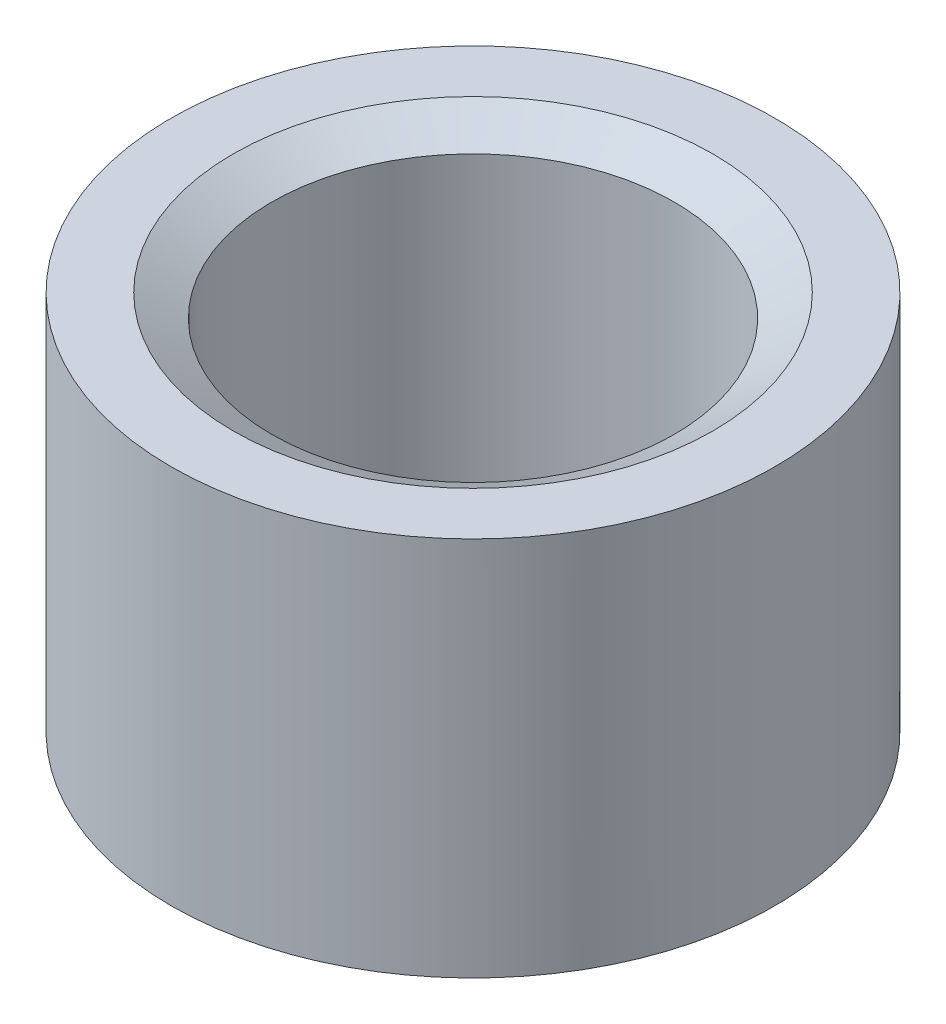
ISO-10303-21;
HEADER;
FILE_DESCRIPTION(('STEP AP214'),'2;1');
FILE_NAME('part.step','',(''),(''),'','','');
FILE_SCHEMA(('AUTOMOTIVE_DESIGN { 1 0 10303 214 1 1 1 1 }'));
ENDSEC;
DATA;
#1=APPLICATION_CONTEXT('core data for automotive mechanical design processes');
#2=APPLICATION_PROTOCOL_DEFINITION('international standard','automotive_design',2000,#1);
#3=PRODUCT_CONTEXT('',#1,'mechanical');
#4=PRODUCT('Part','Part','',(#3));
#5=PRODUCT_RELATED_PRODUCT_CATEGORY('part','',(#4));
#6=PRODUCT_DEFINITION_FORMATION('','',#4);
#7=PRODUCT_DEFINITION_CONTEXT('part definition',#1,'design');
#8=PRODUCT_DEFINITION('design','',#6,#7);
#9=PRODUCT_DEFINITION_SHAPE('','',#8);
#10=(LENGTH_UNIT() NAMED_UNIT(*) SI_UNIT(.MILLI.,.METRE.));
#11=(NAMED_UNIT(*) PLANE_ANGLE_UNIT() SI_UNIT($,.RADIAN.));
#12=(NAMED_UNIT(*) SI_UNIT($,.STERADIAN.) SOLID_ANGLE_UNIT());
#13=UNCERTAINTY_MEASURE_WITH_UNIT(LENGTH_MEASURE(1.E-05),#10,'distance_accuracy_value','');
#14=(GEOMETRIC_REPRESENTATION_CONTEXT(3) GLOBAL_UNCERTAINTY_ASSIGNED_CONTEXT((#13)) GLOBAL_UNIT_ASSIGNED_CONTEXT((#10,
#11,#12)) REPRESENTATION_CONTEXT('',''));
#15=CARTESIAN_POINT('',(0.,0.,0.));
#16=DIRECTION('',(0.,0.,1.));
#17=DIRECTION('',(1.,0.,0.));
#18=AXIS2_PLACEMENT_3D('',#15,#16,#17);
#19=CARTESIAN_POINT('',(0.,0.,0.));
#20=DIRECTION('',(0.,1.,0.));
#21=DIRECTION('',(0.,0.,1.));
#22=AXIS2_PLACEMENT_3D('',#19,#20,#21);
#23=CYLINDRICAL_SURFACE('',#22,2.38125);
#24=CARTESIAN_POINT('',(0.,-2.999023637951,0.));
#25=DIRECTION('',(0.,-1.,0.));
#26=DIRECTION('',(0.,0.,-1.));
#27=AXIS2_PLACEMENT_3D('',#24,#25,#26);
#28=CIRCLE('',#27,2.38125);
#29=CARTESIAN_POINT('',(0.,-2.999023637951,-2.38125));
#30=VERTEX_POINT('',#29);
#31=EDGE_CURVE('E39',#30,#30,#28,.F.);
#32=ORIENTED_EDGE('',*,*,#31,.T.);
#33=EDGE_LOOP('',(#32));
#34=FACE_BOUND('',#33,.T.);
#35=CARTESIAN_POINT('',(0.,0.,0.));
#36=DIRECTION('',(0.,1.,0.));
#37=DIRECTION('',(0.,0.,1.));
#38=AXIS2_PLACEMENT_3D('',#35,#36,#37);
#39=CIRCLE('',#38,2.38125);
#40=CARTESIAN_POINT('',(0.,0.,2.38125));
#41=VERTEX_POINT('',#40);
#42=EDGE_CURVE('E55',#41,#41,#39,.T.);
#43=ORIENTED_EDGE('',*,*,#42,.F.);
#44=EDGE_LOOP('',(#43));
#45=FACE_BOUND('',#44,.T.);
#46=ADVANCED_FACE('F32',(#34,#45),#23,.T.);
#47=CARTESIAN_POINT('',(2.38125,-3.175,0.));
#48=DIRECTION('',(0.,-1.,0.));
#49=DIRECTION('',(0.,0.,-1.));
#50=AXIS2_PLACEMENT_3D('',#47,#48,#49);
#51=PLANE('',#50);
#52=CARTESIAN_POINT('',(0.,-3.175,0.));
#53=DIRECTION('',(0.,-1.,0.));
#54=DIRECTION('',(0.,0.,-1.));
#55=AXIS2_PLACEMENT_3D('',#52,#53,#54);
#56=CIRCLE('',#55,2.07645);
#57=CARTESIAN_POINT('',(0.,-3.175,-2.07645));
#58=VERTEX_POINT('',#57);
#59=EDGE_CURVE('E10',#58,#58,#56,.T.);
#60=ORIENTED_EDGE('',*,*,#59,.T.);
#61=EDGE_LOOP('',(#60));
#62=FACE_BOUND('',#61,.T.);
#63=CARTESIAN_POINT('',(0.,-3.175,0.));
#64=DIRECTION('',(0.,1.,0.));
#65=DIRECTION('',(0.,0.,1.));
#66=AXIS2_PLACEMENT_3D('',#63,#64,#65);
#67=CIRCLE('',#66,1.5875);
#68=CARTESIAN_POINT('',(0.,-3.175,1.5875));
#69=VERTEX_POINT('',#68);
#70=EDGE_CURVE('E52',#69,#69,#67,.T.);
#71=ORIENTED_EDGE('',*,*,#70,.T.);
#72=EDGE_LOOP('',(#71));
#73=FACE_BOUND('',#72,.T.);
#74=ADVANCED_FACE('F62',(#62,#73),#51,.T.);
#75=CARTESIAN_POINT('',(0.,0.,0.));
#76=DIRECTION('',(0.,1.,0.));
#77=DIRECTION('',(0.,0.,1.));
#78=AXIS2_PLACEMENT_3D('',#75,#76,#77);
#79=CYLINDRICAL_SURFACE('',#78,1.5875);
#80=CARTESIAN_POINT('',(0.,-0.175976362048998,0.));
#81=DIRECTION('',(0.,1.,0.));
#82=DIRECTION('',(0.,0.,1.));
#83=AXIS2_PLACEMENT_3D('',#80,#81,#82);
#84=CIRCLE('',#83,1.5875);
#85=CARTESIAN_POINT('',(0.,-0.175976362048998,1.5875));
#86=VERTEX_POINT('',#85);
#87=EDGE_CURVE('E47',#86,#86,#84,.T.);
#88=ORIENTED_EDGE('',*,*,#87,.T.);
#89=EDGE_LOOP('',(#88));
#90=FACE_BOUND('',#89,.T.);
#91=ORIENTED_EDGE('',*,*,#70,.F.);
#92=EDGE_LOOP('',(#91));
#93=FACE_BOUND('',#92,.T.);
#94=ADVANCED_FACE('F67',(#90,#93),#79,.F.);
#95=CARTESIAN_POINT('',(2.38125,0.,0.));
#96=DIRECTION('',(0.,1.,0.));
#97=DIRECTION('',(0.,0.,1.));
#98=AXIS2_PLACEMENT_3D('',#95,#96,#97);
#99=PLANE('',#98);
#100=CARTESIAN_POINT('',(0.,0.,0.));
#101=DIRECTION('',(0.,1.,0.));
#102=DIRECTION('',(0.,0.,1.));
#103=AXIS2_PLACEMENT_3D('',#100,#101,#102);
#104=CIRCLE('',#103,1.8923);
#105=CARTESIAN_POINT('',(0.,0.,1.8923));
#106=VERTEX_POINT('',#105);
#107=EDGE_CURVE('E43',#106,#106,#104,.F.);
#108=ORIENTED_EDGE('',*,*,#107,.T.);
#109=EDGE_LOOP('',(#108));
#110=FACE_BOUND('',#109,.T.);
#111=ORIENTED_EDGE('',*,*,#42,.T.);
#112=EDGE_LOOP('',(#111));
#113=FACE_BOUND('',#112,.T.);
#114=ADVANCED_FACE('F59',(#110,#113),#99,.T.);
#115=CARTESIAN_POINT('',(0.,-0.175976362048998,0.));
#116=DIRECTION('',(0.,1.,0.));
#117=DIRECTION('',(0.,0.,1.));
#118=AXIS2_PLACEMENT_3D('',#115,#116,#117);
#119=CONICAL_SURFACE('',#118,1.5875,1.0471975511966);
#120=CARTESIAN_POINT('',(0.,0.,1.8923));
#121=CARTESIAN_POINT('',(0.,-0.001833087104677,1.889125));
#122=CARTESIAN_POINT('',(0.,-0.00366617420935408,1.88595));
#123=CARTESIAN_POINT('',(0.,-0.00733234841870824,1.8796));
#124=CARTESIAN_POINT('',(0.,-0.00916543552338533,1.876425));
#125=CARTESIAN_POINT('',(0.,-0.0128316097327394,1.870075));
#126=CARTESIAN_POINT('',(0.,-0.0146646968374165,1.8669));
#127=CARTESIAN_POINT('',(0.,-0.0183308710467706,1.86055));
#128=CARTESIAN_POINT('',(0.,-0.0201639581514477,1.857375));
#129=CARTESIAN_POINT('',(0.,-0.0238301323608018,1.851025));
#130=CARTESIAN_POINT('',(0.,-0.0256632194654789,1.84785));
#131=CARTESIAN_POINT('',(0.,-0.029329393674833,1.8415));
#132=CARTESIAN_POINT('',(0.,-0.0311624807795101,1.838325));
#133=CARTESIAN_POINT('',(0.,-0.0348286549888642,1.831975));
#134=CARTESIAN_POINT('',(0.,-0.0366617420935413,1.8288));
#135=CARTESIAN_POINT('',(0.,-0.0403279163028954,1.82245));
#136=CARTESIAN_POINT('',(0.,-0.0421610034075725,1.819275));
#137=CARTESIAN_POINT('',(0.,-0.0458271776169266,1.812925));
#138=CARTESIAN_POINT('',(0.,-0.0476602647216036,1.80975));
#139=CARTESIAN_POINT('',(0.,-0.0513264389309578,1.8034));
#140=CARTESIAN_POINT('',(0.,-0.0531595260356348,1.800225));
#141=CARTESIAN_POINT('',(0.,-0.056825700244989,1.793875));
#142=CARTESIAN_POINT('',(0.,-0.058658787349666,1.7907));
#143=CARTESIAN_POINT('',(0.,-0.0623249615590202,1.78435));
#144=CARTESIAN_POINT('',(0.,-0.0641580486636972,1.781175));
#145=CARTESIAN_POINT('',(0.,-0.0678242228730514,1.774825));
#146=CARTESIAN_POINT('',(0.,-0.0696573099777284,1.77165));
#147=CARTESIAN_POINT('',(0.,-0.0733234841870825,1.7653));
#148=CARTESIAN_POINT('',(0.,-0.0751565712917596,1.762125));
#149=CARTESIAN_POINT('',(0.,-0.0788227455011138,1.755775));
#150=CARTESIAN_POINT('',(0.,-0.0806558326057908,1.7526));
#151=CARTESIAN_POINT('',(0.,-0.0843220068151449,1.74625));
#152=CARTESIAN_POINT('',(0.,-0.086155093919822,1.743075));
#153=CARTESIAN_POINT('',(0.,-0.0898212681291762,1.736725));
#154=CARTESIAN_POINT('',(0.,-0.0916543552338532,1.73355));
#155=CARTESIAN_POINT('',(0.,-0.0953205294432073,1.7272));
#156=CARTESIAN_POINT('',(0.,-0.0971536165478844,1.724025));
#157=CARTESIAN_POINT('',(0.,-0.100819790757239,1.717675));
#158=CARTESIAN_POINT('',(0.,-0.102652877861916,1.7145));
#159=CARTESIAN_POINT('',(0.,-0.10631905207127,1.70815));
#160=CARTESIAN_POINT('',(0.,-0.108152139175947,1.704975));
#161=CARTESIAN_POINT('',(0.,-0.111818313385301,1.698625));
#162=CARTESIAN_POINT('',(0.,-0.113651400489978,1.69545));
#163=CARTESIAN_POINT('',(0.,-0.117317574699332,1.6891));
#164=CARTESIAN_POINT('',(0.,-0.119150661804009,1.685925));
#165=CARTESIAN_POINT('',(0.,-0.122816836013363,1.679575));
#166=CARTESIAN_POINT('',(0.,-0.12464992311804,1.6764));
#167=CARTESIAN_POINT('',(0.,-0.128316097327394,1.67005));
#168=CARTESIAN_POINT('',(0.,-0.130149184432072,1.666875));
#169=CARTESIAN_POINT('',(0.,-0.133815358641426,1.660525));
#170=CARTESIAN_POINT('',(0.,-0.135648445746103,1.65735));
#171=CARTESIAN_POINT('',(0.,-0.139314619955457,1.651));
#172=CARTESIAN_POINT('',(0.,-0.141147707060134,1.647825));
#173=CARTESIAN_POINT('',(0.,-0.144813881269488,1.641475));
#174=CARTESIAN_POINT('',(0.,-0.146646968374165,1.6383));
#175=CARTESIAN_POINT('',(0.,-0.150313142583519,1.63195));
#176=CARTESIAN_POINT('',(0.,-0.152146229688196,1.628775));
#177=CARTESIAN_POINT('',(0.,-0.15581240389755,1.622425));
#178=CARTESIAN_POINT('',(0.,-0.157645491002228,1.61925));
#179=CARTESIAN_POINT('',(0.,-0.161311665211582,1.6129));
#180=CARTESIAN_POINT('',(0.,-0.163144752316259,1.609725));
#181=CARTESIAN_POINT('',(0.,-0.166810926525613,1.603375));
#182=CARTESIAN_POINT('',(0.,-0.16864401363029,1.6002));
#183=CARTESIAN_POINT('',(0.,-0.172310187839644,1.59385));
#184=CARTESIAN_POINT('',(0.,-0.174143274944321,1.590675));
#185=CARTESIAN_POINT('',(0.,-0.175976362048998,1.5875));
#186=B_SPLINE_CURVE_WITH_KNOTS('',3,(#120,#121,#122,#123,#124,#125,#126,#127,#128,#129,#130,
#131,#132,#133,#134,#135,#136,#137,#138,#139,#140,#141,#142,#143,#144,#145,#146,#147,#148,#149,
#150,#151,#152,#153,#154,#155,#156,#157,#158,#159,#160,#161,#162,#163,#164,#165,#166,#167,#168,
#169,#170,#171,#172,#173,#174,#175,#176,#177,#178,#179,#180,#181,#182,#183,#184,#185),
.UNSPECIFIED.,.F.,.F.,(4,2,2,2,2,2,2,2,2,2,2,2,2,2,2,2,2,2,2,2,2,2,2,2,2,2,2,2,2,2,2,2,4),(0.,
0.0109985226280624,0.0219970452561248,0.0329955678841874,0.0439940905122498,0.0549926131403122,
0.0659911357683746,0.076989658396437,0.0879881810244996,0.098986703652562,0.109985226280624,
0.120983748908687,0.131982271536749,0.142980794164812,0.153979316792874,0.164977839420937,
0.175976362048999,0.186974884677061,0.197973407305124,0.208971929933186,0.219970452561249,
0.230968975189311,0.241967497817374,0.252966020445436,0.263964543073499,0.274963065701561,
0.285961588329623,0.296960110957686,0.307958633585748,0.318957156213811,0.329955678841873,
0.340954201469935,0.351952724097998),.UNSPECIFIED.);
#187=EDGE_CURVE('BSEAM70',#106,#86,#186,.T.);
#188=ORIENTED_EDGE('',*,*,#107,.F.);
#189=ORIENTED_EDGE('',*,*,#87,.F.);
#190=ORIENTED_EDGE('',*,*,#187,.T.);
#191=ORIENTED_EDGE('',*,*,#187,.F.);
#192=EDGE_LOOP('',(#188,#190,#189,#191));
#193=FACE_BOUND('',#192,.T.);
#194=ADVANCED_FACE('F70',(#193),#119,.F.);
#195=CARTESIAN_POINT('',(0.,-2.999023637951,0.));
#196=DIRECTION('',(0.,1.,0.));
#197=DIRECTION('',(0.,0.,1.));
#198=AXIS2_PLACEMENT_3D('',#195,#196,#197);
#199=CONICAL_SURFACE('',#198,2.38125,1.0471975511966);
#200=ORIENTED_EDGE('',*,*,#59,.F.);
#201=EDGE_LOOP('',(#200));
#202=FACE_BOUND('',#201,.T.);
#203=ORIENTED_EDGE('',*,*,#31,.F.);
#204=EDGE_LOOP('',(#203));
#205=FACE_BOUND('',#204,.T.);
#206=ADVANCED_FACE('F34',(#202,#205),#199,.T.);
#207=CLOSED_SHELL('',(#46,#74,#94,#114,#194,#206));
#208=MANIFOLD_SOLID_BREP('B2',#207);
#209=ADVANCED_BREP_SHAPE_REPRESENTATION('',(#18,#208),#14);
#210=SHAPE_DEFINITION_REPRESENTATION(#9,#209);
ENDSEC;
END-ISO-10303-21;
